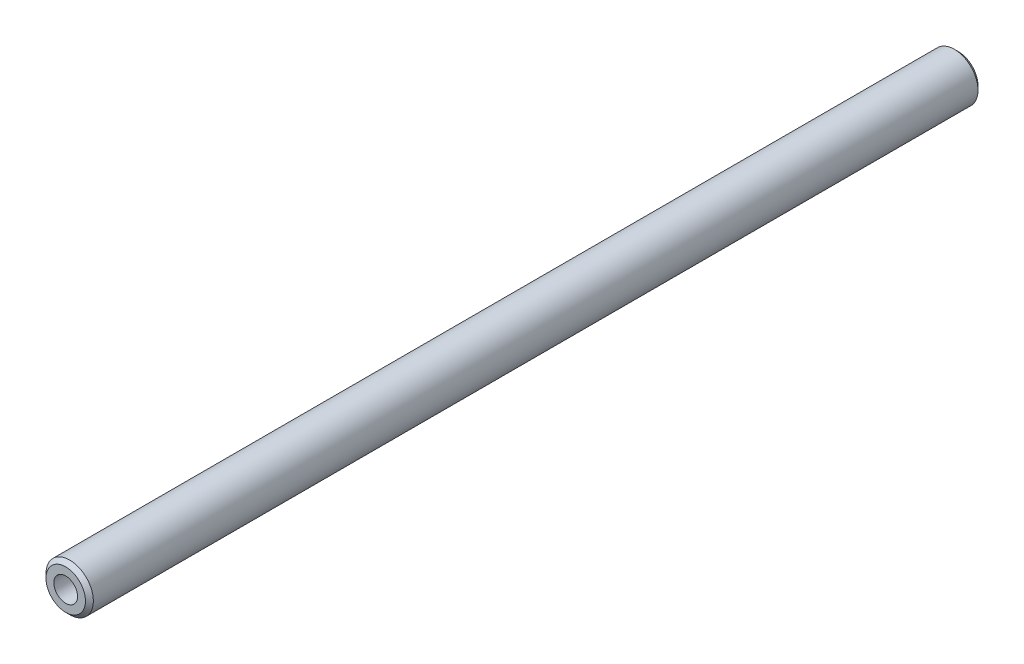
ISO-10303-21;
HEADER;
FILE_DESCRIPTION(('STEP AP214'),'2;1');
FILE_NAME('part.step','',(''),(''),'','','');
FILE_SCHEMA(('AUTOMOTIVE_DESIGN { 1 0 10303 214 1 1 1 1 }'));
ENDSEC;
DATA;
#1=APPLICATION_CONTEXT('core data for automotive mechanical design processes');
#2=APPLICATION_PROTOCOL_DEFINITION('international standard','automotive_design',2000,#1);
#3=PRODUCT_CONTEXT('',#1,'mechanical');
#4=PRODUCT('Part','Part','',(#3));
#5=PRODUCT_RELATED_PRODUCT_CATEGORY('part','',(#4));
#6=PRODUCT_DEFINITION_FORMATION('','',#4);
#7=PRODUCT_DEFINITION_CONTEXT('part definition',#1,'design');
#8=PRODUCT_DEFINITION('design','',#6,#7);
#9=PRODUCT_DEFINITION_SHAPE('','',#8);
#10=(LENGTH_UNIT() NAMED_UNIT(*) SI_UNIT(.MILLI.,.METRE.));
#11=(NAMED_UNIT(*) PLANE_ANGLE_UNIT() SI_UNIT($,.RADIAN.));
#12=(NAMED_UNIT(*) SI_UNIT($,.STERADIAN.) SOLID_ANGLE_UNIT());
#13=UNCERTAINTY_MEASURE_WITH_UNIT(LENGTH_MEASURE(1.E-05),#10,'distance_accuracy_value','');
#14=(GEOMETRIC_REPRESENTATION_CONTEXT(3) GLOBAL_UNCERTAINTY_ASSIGNED_CONTEXT((#13)) GLOBAL_UNIT_ASSIGNED_CONTEXT((#10,
#11,#12)) REPRESENTATION_CONTEXT('',''));
#15=CARTESIAN_POINT('',(0.,0.,0.));
#16=DIRECTION('',(0.,0.,1.));
#17=DIRECTION('',(1.,0.,0.));
#18=AXIS2_PLACEMENT_3D('',#15,#16,#17);
#19=CARTESIAN_POINT('',(0.,0.,226.));
#20=DIRECTION('',(0.,0.,1.));
#21=DIRECTION('',(1.,0.,0.));
#22=AXIS2_PLACEMENT_3D('',#19,#20,#21);
#23=PLANE('',#22);
#24=CARTESIAN_POINT('',(0.,0.,226.));
#25=DIRECTION('',(0.,0.,1.));
#26=DIRECTION('',(1.,0.,0.));
#27=AXIS2_PLACEMENT_3D('',#24,#25,#26);
#28=CIRCLE('',#27,5.00000000000003);
#29=CARTESIAN_POINT('',(5.00000000000003,0.,226.));
#30=VERTEX_POINT('',#29);
#31=EDGE_CURVE('E53',#30,#30,#28,.T.);
#32=ORIENTED_EDGE('',*,*,#31,.T.);
#33=EDGE_LOOP('',(#32));
#34=FACE_BOUND('',#33,.T.);
#35=CARTESIAN_POINT('',(0.,0.,226.));
#36=DIRECTION('',(0.,0.,1.));
#37=DIRECTION('',(1.,0.,0.));
#38=AXIS2_PLACEMENT_3D('',#35,#36,#37);
#39=CIRCLE('',#38,3.);
#40=CARTESIAN_POINT('',(3.,0.,226.));
#41=VERTEX_POINT('',#40);
#42=EDGE_CURVE('E58',#41,#41,#39,.T.);
#43=ORIENTED_EDGE('',*,*,#42,.F.);
#44=EDGE_LOOP('',(#43));
#45=FACE_BOUND('',#44,.T.);
#46=ADVANCED_FACE('F37',(#34,#45),#23,.T.);
#47=CARTESIAN_POINT('',(0.,0.,0.));
#48=DIRECTION('',(0.,0.,1.));
#49=DIRECTION('',(1.,0.,0.));
#50=AXIS2_PLACEMENT_3D('',#47,#48,#49);
#51=PLANE('',#50);
#52=CARTESIAN_POINT('',(0.,0.,0.));
#53=DIRECTION('',(0.,0.,1.));
#54=DIRECTION('',(1.,0.,0.));
#55=AXIS2_PLACEMENT_3D('',#52,#53,#54);
#56=CIRCLE('',#55,5.00000000000003);
#57=CARTESIAN_POINT('',(5.00000000000003,0.,0.));
#58=VERTEX_POINT('',#57);
#59=EDGE_CURVE('E10',#58,#58,#56,.F.);
#60=ORIENTED_EDGE('',*,*,#59,.T.);
#61=EDGE_LOOP('',(#60));
#62=FACE_BOUND('',#61,.T.);
#63=CARTESIAN_POINT('',(0.,0.,0.));
#64=DIRECTION('',(0.,0.,1.));
#65=DIRECTION('',(1.,0.,0.));
#66=AXIS2_PLACEMENT_3D('',#63,#64,#65);
#67=CIRCLE('',#66,3.);
#68=CARTESIAN_POINT('',(3.,0.,0.));
#69=VERTEX_POINT('',#68);
#70=EDGE_CURVE('E59',#69,#69,#67,.T.);
#71=ORIENTED_EDGE('',*,*,#70,.T.);
#72=EDGE_LOOP('',(#71));
#73=FACE_BOUND('',#72,.T.);
#74=ADVANCED_FACE('F69',(#62,#73),#51,.F.);
#75=CARTESIAN_POINT('',(0.,0.,226.));
#76=DIRECTION('',(0.,0.,-1.));
#77=DIRECTION('',(-1.,0.,0.));
#78=AXIS2_PLACEMENT_3D('',#75,#76,#77);
#79=CYLINDRICAL_SURFACE('',#78,6.);
#80=CARTESIAN_POINT('',(0.,0.,225.));
#81=DIRECTION('',(0.,0.,1.));
#82=DIRECTION('',(1.,0.,0.));
#83=AXIS2_PLACEMENT_3D('',#80,#81,#82);
#84=CIRCLE('',#83,6.);
#85=CARTESIAN_POINT('',(6.,0.,225.));
#86=VERTEX_POINT('',#85);
#87=EDGE_CURVE('E45',#86,#86,#84,.F.);
#88=ORIENTED_EDGE('',*,*,#87,.T.);
#89=EDGE_LOOP('',(#88));
#90=FACE_BOUND('',#89,.T.);
#91=CARTESIAN_POINT('',(0.,0.,0.999999999999973));
#92=DIRECTION('',(0.,0.,1.));
#93=DIRECTION('',(1.,0.,0.));
#94=AXIS2_PLACEMENT_3D('',#91,#92,#93);
#95=CIRCLE('',#94,6.);
#96=CARTESIAN_POINT('',(6.,0.,0.999999999999973));
#97=VERTEX_POINT('',#96);
#98=EDGE_CURVE('E49',#97,#97,#95,.T.);
#99=ORIENTED_EDGE('',*,*,#98,.T.);
#100=EDGE_LOOP('',(#99));
#101=FACE_BOUND('',#100,.T.);
#102=ADVANCED_FACE('F75',(#90,#101),#79,.T.);
#103=CARTESIAN_POINT('',(0.,0.,226.));
#104=DIRECTION('',(0.,0.,-1.));
#105=DIRECTION('',(-1.,0.,0.));
#106=AXIS2_PLACEMENT_3D('',#103,#104,#105);
#107=CYLINDRICAL_SURFACE('',#106,3.);
#108=ORIENTED_EDGE('',*,*,#42,.T.);
#109=EDGE_LOOP('',(#108));
#110=FACE_BOUND('',#109,.T.);
#111=ORIENTED_EDGE('',*,*,#70,.F.);
#112=EDGE_LOOP('',(#111));
#113=FACE_BOUND('',#112,.T.);
#114=ADVANCED_FACE('F65',(#110,#113),#107,.F.);
#115=CARTESIAN_POINT('',(0.,0.,226.));
#116=DIRECTION('',(0.,0.,-1.));
#117=DIRECTION('',(-1.,0.,0.));
#118=AXIS2_PLACEMENT_3D('',#115,#116,#117);
#119=CONICAL_SURFACE('',#118,5.00000000000003,0.785398163397432);
#120=ORIENTED_EDGE('',*,*,#87,.F.);
#121=EDGE_LOOP('',(#120));
#122=FACE_BOUND('',#121,.T.);
#123=ORIENTED_EDGE('',*,*,#31,.F.);
#124=EDGE_LOOP('',(#123));
#125=FACE_BOUND('',#124,.T.);
#126=ADVANCED_FACE('F81',(#122,#125),#119,.T.);
#127=CARTESIAN_POINT('',(0.,0.,0.999999999999973));
#128=DIRECTION('',(0.,0.,1.));
#129=DIRECTION('',(1.,0.,0.));
#130=AXIS2_PLACEMENT_3D('',#127,#128,#129);
#131=CONICAL_SURFACE('',#130,6.,0.785398163397446);
#132=ORIENTED_EDGE('',*,*,#59,.F.);
#133=EDGE_LOOP('',(#132));
#134=FACE_BOUND('',#133,.T.);
#135=ORIENTED_EDGE('',*,*,#98,.F.);
#136=EDGE_LOOP('',(#135));
#137=FACE_BOUND('',#136,.T.);
#138=ADVANCED_FACE('F40',(#134,#137),#131,.T.);
#139=CLOSED_SHELL('',(#46,#74,#102,#114,#126,#138));
#140=MANIFOLD_SOLID_BREP('B2',#139);
#141=ADVANCED_BREP_SHAPE_REPRESENTATION('',(#18,#140),#14);
#142=SHAPE_DEFINITION_REPRESENTATION(#9,#141);
ENDSEC;
END-ISO-10303-21;
